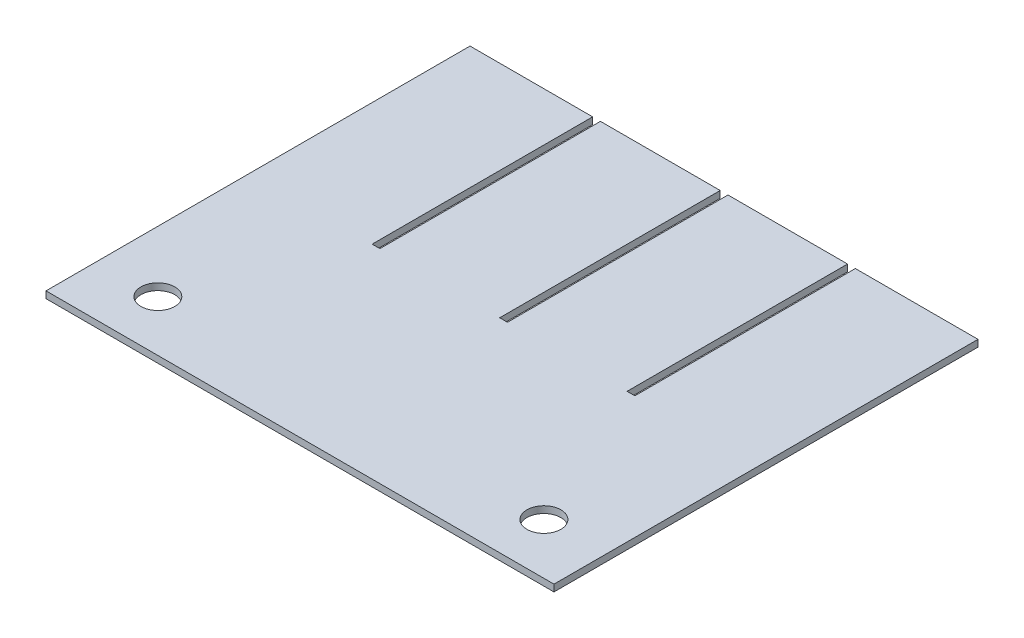
ISO-10303-21;
HEADER;
FILE_DESCRIPTION(('STEP AP214'),'2;1');
FILE_NAME('part.step','',(''),(''),'','','');
FILE_SCHEMA(('AUTOMOTIVE_DESIGN { 1 0 10303 214 1 1 1 1 }'));
ENDSEC;
DATA;
#1=APPLICATION_CONTEXT('core data for automotive mechanical design processes');
#2=APPLICATION_PROTOCOL_DEFINITION('international standard','automotive_design',2000,#1);
#3=PRODUCT_CONTEXT('',#1,'mechanical');
#4=PRODUCT('Part','Part','',(#3));
#5=PRODUCT_RELATED_PRODUCT_CATEGORY('part','',(#4));
#6=PRODUCT_DEFINITION_FORMATION('','',#4);
#7=PRODUCT_DEFINITION_CONTEXT('part definition',#1,'design');
#8=PRODUCT_DEFINITION('design','',#6,#7);
#9=PRODUCT_DEFINITION_SHAPE('','',#8);
#10=(LENGTH_UNIT() NAMED_UNIT(*) SI_UNIT(.MILLI.,.METRE.));
#11=(NAMED_UNIT(*) PLANE_ANGLE_UNIT() SI_UNIT($,.RADIAN.));
#12=(NAMED_UNIT(*) SI_UNIT($,.STERADIAN.) SOLID_ANGLE_UNIT());
#13=UNCERTAINTY_MEASURE_WITH_UNIT(LENGTH_MEASURE(1.E-05),#10,'distance_accuracy_value','');
#14=(GEOMETRIC_REPRESENTATION_CONTEXT(3) GLOBAL_UNCERTAINTY_ASSIGNED_CONTEXT((#13)) GLOBAL_UNIT_ASSIGNED_CONTEXT((#10,
#11,#12)) REPRESENTATION_CONTEXT('',''));
#15=CARTESIAN_POINT('',(0.,0.,0.));
#16=DIRECTION('',(0.,0.,1.));
#17=DIRECTION('',(1.,0.,0.));
#18=AXIS2_PLACEMENT_3D('',#15,#16,#17);
#19=CARTESIAN_POINT('',(0.,2.,0.));
#20=DIRECTION('',(0.,1.,0.));
#21=DIRECTION('',(0.,0.,1.));
#22=AXIS2_PLACEMENT_3D('',#19,#20,#21);
#23=PLANE('',#22);
#24=CARTESIAN_POINT('',(-56.905,2.,47.5));
#25=DIRECTION('',(0.,1.,0.));
#26=DIRECTION('',(0.,0.,1.));
#27=AXIS2_PLACEMENT_3D('',#24,#25,#26);
#28=CIRCLE('',#27,5.);
#29=CARTESIAN_POINT('',(-56.905,2.,52.5));
#30=VERTEX_POINT('',#29);
#31=EDGE_CURVE('E186',#30,#30,#28,.T.);
#32=ORIENTED_EDGE('',*,*,#31,.F.);
#33=EDGE_LOOP('',(#32));
#34=FACE_BOUND('',#33,.T.);
#35=DIRECTION('',(0.,0.,-1.));
#36=VECTOR('',#35,1.);
#37=CARTESIAN_POINT('',(74.875,2.,-62.5));
#38=LINE('',#37,#36);
#39=CARTESIAN_POINT('',(74.875,2.,62.5));
#40=VERTEX_POINT('',#39);
#41=CARTESIAN_POINT('',(74.875,2.,-62.5));
#42=VERTEX_POINT('',#41);
#43=EDGE_CURVE('E213',#40,#42,#38,.T.);
#44=ORIENTED_EDGE('',*,*,#43,.T.);
#45=DIRECTION('',(-1.,0.,0.));
#46=VECTOR('',#45,1.);
#47=CARTESIAN_POINT('',(38.725,2.,-62.5));
#48=LINE('',#47,#46);
#49=CARTESIAN_POINT('',(38.725,2.,-62.5));
#50=VERTEX_POINT('',#49);
#51=EDGE_CURVE('E121',#42,#50,#48,.T.);
#52=ORIENTED_EDGE('',*,*,#51,.T.);
#53=DIRECTION('',(0.,0.,1.));
#54=VECTOR('',#53,1.);
#55=CARTESIAN_POINT('',(38.725,2.,-62.5));
#56=LINE('',#55,#54);
#57=CARTESIAN_POINT('',(38.725,2.,2.5));
#58=VERTEX_POINT('',#57);
#59=EDGE_CURVE('E252',#50,#58,#56,.T.);
#60=ORIENTED_EDGE('',*,*,#59,.T.);
#61=DIRECTION('',(-1.,0.,0.));
#62=VECTOR('',#61,1.);
#63=CARTESIAN_POINT('',(38.725,2.,2.5));
#64=LINE('',#63,#62);
#65=CARTESIAN_POINT('',(36.425,2.,2.5));
#66=VERTEX_POINT('',#65);
#67=EDGE_CURVE('E271',#58,#66,#64,.T.);
#68=ORIENTED_EDGE('',*,*,#67,.T.);
#69=DIRECTION('',(0.,0.,-1.));
#70=VECTOR('',#69,1.);
#71=CARTESIAN_POINT('',(36.425,2.,-62.5));
#72=LINE('',#71,#70);
#73=CARTESIAN_POINT('',(36.425,2.,-62.5));
#74=VERTEX_POINT('',#73);
#75=EDGE_CURVE('E268',#66,#74,#72,.T.);
#76=ORIENTED_EDGE('',*,*,#75,.T.);
#77=DIRECTION('',(-1.,0.,0.));
#78=VECTOR('',#77,1.);
#79=CARTESIAN_POINT('',(1.17500000000002,2.,-62.5));
#80=LINE('',#79,#78);
#81=CARTESIAN_POINT('',(1.17500000000002,2.,-62.5));
#82=VERTEX_POINT('',#81);
#83=EDGE_CURVE('E270',#74,#82,#80,.T.);
#84=ORIENTED_EDGE('',*,*,#83,.T.);
#85=DIRECTION('',(0.,0.,1.));
#86=VECTOR('',#85,1.);
#87=CARTESIAN_POINT('',(1.17500000000002,2.,-62.5));
#88=LINE('',#87,#86);
#89=CARTESIAN_POINT('',(1.17500000000003,2.,2.5));
#90=VERTEX_POINT('',#89);
#91=EDGE_CURVE('E273',#82,#90,#88,.T.);
#92=ORIENTED_EDGE('',*,*,#91,.T.);
#93=DIRECTION('',(-1.,0.,0.));
#94=VECTOR('',#93,1.);
#95=CARTESIAN_POINT('',(-1.12499999999997,2.,2.5));
#96=LINE('',#95,#94);
#97=CARTESIAN_POINT('',(-1.12499999999997,2.,2.5));
#98=VERTEX_POINT('',#97);
#99=EDGE_CURVE('E279',#90,#98,#96,.T.);
#100=ORIENTED_EDGE('',*,*,#99,.T.);
#101=DIRECTION('',(0.,0.,-1.));
#102=VECTOR('',#101,1.);
#103=CARTESIAN_POINT('',(-1.12499999999998,2.,-62.5));
#104=LINE('',#103,#102);
#105=CARTESIAN_POINT('',(-1.12499999999998,2.,-62.5));
#106=VERTEX_POINT('',#105);
#107=EDGE_CURVE('E281',#98,#106,#104,.T.);
#108=ORIENTED_EDGE('',*,*,#107,.T.);
#109=DIRECTION('',(-1.,0.,0.));
#110=VECTOR('',#109,1.);
#111=CARTESIAN_POINT('',(-36.425,2.,-62.5));
#112=LINE('',#111,#110);
#113=CARTESIAN_POINT('',(-36.425,2.,-62.5));
#114=VERTEX_POINT('',#113);
#115=EDGE_CURVE('E283',#106,#114,#112,.T.);
#116=ORIENTED_EDGE('',*,*,#115,.T.);
#117=DIRECTION('',(0.,0.,1.));
#118=VECTOR('',#117,1.);
#119=CARTESIAN_POINT('',(-36.425,2.,-62.5));
#120=LINE('',#119,#118);
#121=CARTESIAN_POINT('',(-36.425,2.,2.5));
#122=VERTEX_POINT('',#121);
#123=EDGE_CURVE('E285',#114,#122,#120,.T.);
#124=ORIENTED_EDGE('',*,*,#123,.T.);
#125=DIRECTION('',(-1.,0.,0.));
#126=VECTOR('',#125,1.);
#127=CARTESIAN_POINT('',(-38.725,2.,2.5));
#128=LINE('',#127,#126);
#129=CARTESIAN_POINT('',(-38.725,2.,2.5));
#130=VERTEX_POINT('',#129);
#131=EDGE_CURVE('E287',#122,#130,#128,.T.);
#132=ORIENTED_EDGE('',*,*,#131,.T.);
#133=DIRECTION('',(0.,0.,-1.));
#134=VECTOR('',#133,1.);
#135=CARTESIAN_POINT('',(-38.725,2.,-62.5));
#136=LINE('',#135,#134);
#137=CARTESIAN_POINT('',(-38.725,2.,-62.5));
#138=VERTEX_POINT('',#137);
#139=EDGE_CURVE('E164',#130,#138,#136,.T.);
#140=ORIENTED_EDGE('',*,*,#139,.T.);
#141=DIRECTION('',(-1.,0.,0.));
#142=VECTOR('',#141,1.);
#143=CARTESIAN_POINT('',(-74.875,2.,-62.5));
#144=LINE('',#143,#142);
#145=CARTESIAN_POINT('',(-74.875,2.,-62.5));
#146=VERTEX_POINT('',#145);
#147=EDGE_CURVE('E158',#138,#146,#144,.T.);
#148=ORIENTED_EDGE('',*,*,#147,.T.);
#149=DIRECTION('',(0.,0.,1.));
#150=VECTOR('',#149,1.);
#151=CARTESIAN_POINT('',(-74.875,2.,-62.5));
#152=LINE('',#151,#150);
#153=CARTESIAN_POINT('',(-74.875,2.,62.5));
#154=VERTEX_POINT('',#153);
#155=EDGE_CURVE('E162',#146,#154,#152,.T.);
#156=ORIENTED_EDGE('',*,*,#155,.T.);
#157=DIRECTION('',(1.,0.,0.));
#158=VECTOR('',#157,1.);
#159=CARTESIAN_POINT('',(-74.875,2.,62.5));
#160=LINE('',#159,#158);
#161=EDGE_CURVE('E54',#154,#40,#160,.T.);
#162=ORIENTED_EDGE('',*,*,#161,.T.);
#163=EDGE_LOOP('',(#44,#52,#60,#68,#76,#84,#92,#100,#108,#116,#124,#132,#140,#148,#156,#162));
#164=FACE_BOUND('',#163,.T.);
#165=CARTESIAN_POINT('',(56.905,2.,47.5));
#166=DIRECTION('',(0.,1.,0.));
#167=DIRECTION('',(0.,0.,1.));
#168=AXIS2_PLACEMENT_3D('',#165,#166,#167);
#169=CIRCLE('',#168,5.);
#170=CARTESIAN_POINT('',(56.905,2.,52.5));
#171=VERTEX_POINT('',#170);
#172=EDGE_CURVE('E329',#171,#171,#169,.T.);
#173=ORIENTED_EDGE('',*,*,#172,.F.);
#174=EDGE_LOOP('',(#173));
#175=FACE_BOUND('',#174,.T.);
#176=ADVANCED_FACE('F37',(#34,#164,#175),#23,.T.);
#177=CARTESIAN_POINT('',(0.,0.,0.));
#178=DIRECTION('',(0.,1.,0.));
#179=DIRECTION('',(0.,0.,1.));
#180=AXIS2_PLACEMENT_3D('',#177,#178,#179);
#181=PLANE('',#180);
#182=DIRECTION('',(0.,0.,-1.));
#183=VECTOR('',#182,1.);
#184=CARTESIAN_POINT('',(74.875,0.,-62.5));
#185=LINE('',#184,#183);
#186=CARTESIAN_POINT('',(74.875,0.,62.5));
#187=VERTEX_POINT('',#186);
#188=CARTESIAN_POINT('',(74.875,0.,-62.5));
#189=VERTEX_POINT('',#188);
#190=EDGE_CURVE('E182',#187,#189,#185,.T.);
#191=ORIENTED_EDGE('',*,*,#190,.F.);
#192=DIRECTION('',(1.,0.,0.));
#193=VECTOR('',#192,1.);
#194=CARTESIAN_POINT('',(-74.875,0.,62.5));
#195=LINE('',#194,#193);
#196=CARTESIAN_POINT('',(-74.875,0.,62.5));
#197=VERTEX_POINT('',#196);
#198=EDGE_CURVE('E113',#197,#187,#195,.T.);
#199=ORIENTED_EDGE('',*,*,#198,.F.);
#200=DIRECTION('',(0.,0.,1.));
#201=VECTOR('',#200,1.);
#202=CARTESIAN_POINT('',(-74.875,0.,-62.5));
#203=LINE('',#202,#201);
#204=CARTESIAN_POINT('',(-74.875,0.,-62.5));
#205=VERTEX_POINT('',#204);
#206=EDGE_CURVE('E107',#205,#197,#203,.T.);
#207=ORIENTED_EDGE('',*,*,#206,.F.);
#208=DIRECTION('',(-1.,0.,0.));
#209=VECTOR('',#208,1.);
#210=CARTESIAN_POINT('',(-74.875,0.,-62.5));
#211=LINE('',#210,#209);
#212=CARTESIAN_POINT('',(-38.725,0.,-62.5));
#213=VERTEX_POINT('',#212);
#214=EDGE_CURVE('E172',#213,#205,#211,.T.);
#215=ORIENTED_EDGE('',*,*,#214,.F.);
#216=DIRECTION('',(0.,0.,-1.));
#217=VECTOR('',#216,1.);
#218=CARTESIAN_POINT('',(-38.725,0.,-62.5));
#219=LINE('',#218,#217);
#220=CARTESIAN_POINT('',(-38.725,0.,2.5));
#221=VERTEX_POINT('',#220);
#222=EDGE_CURVE('E208',#221,#213,#219,.T.);
#223=ORIENTED_EDGE('',*,*,#222,.F.);
#224=DIRECTION('',(-1.,0.,0.));
#225=VECTOR('',#224,1.);
#226=CARTESIAN_POINT('',(-38.725,0.,2.5));
#227=LINE('',#226,#225);
#228=CARTESIAN_POINT('',(-36.425,0.,2.5));
#229=VERTEX_POINT('',#228);
#230=EDGE_CURVE('E206',#229,#221,#227,.T.);
#231=ORIENTED_EDGE('',*,*,#230,.F.);
#232=DIRECTION('',(0.,0.,1.));
#233=VECTOR('',#232,1.);
#234=CARTESIAN_POINT('',(-36.425,0.,-62.5));
#235=LINE('',#234,#233);
#236=CARTESIAN_POINT('',(-36.425,0.,-62.5));
#237=VERTEX_POINT('',#236);
#238=EDGE_CURVE('E204',#237,#229,#235,.T.);
#239=ORIENTED_EDGE('',*,*,#238,.F.);
#240=DIRECTION('',(-1.,0.,0.));
#241=VECTOR('',#240,1.);
#242=CARTESIAN_POINT('',(-36.425,0.,-62.5));
#243=LINE('',#242,#241);
#244=CARTESIAN_POINT('',(-1.12499999999998,0.,-62.5));
#245=VERTEX_POINT('',#244);
#246=EDGE_CURVE('E202',#245,#237,#243,.T.);
#247=ORIENTED_EDGE('',*,*,#246,.F.);
#248=DIRECTION('',(0.,0.,-1.));
#249=VECTOR('',#248,1.);
#250=CARTESIAN_POINT('',(-1.12499999999998,0.,-62.5));
#251=LINE('',#250,#249);
#252=CARTESIAN_POINT('',(-1.12499999999997,0.,2.5));
#253=VERTEX_POINT('',#252);
#254=EDGE_CURVE('E200',#253,#245,#251,.T.);
#255=ORIENTED_EDGE('',*,*,#254,.F.);
#256=DIRECTION('',(-1.,0.,0.));
#257=VECTOR('',#256,1.);
#258=CARTESIAN_POINT('',(-1.12499999999997,0.,2.5));
#259=LINE('',#258,#257);
#260=CARTESIAN_POINT('',(1.17500000000003,0.,2.5));
#261=VERTEX_POINT('',#260);
#262=EDGE_CURVE('E198',#261,#253,#259,.T.);
#263=ORIENTED_EDGE('',*,*,#262,.F.);
#264=DIRECTION('',(0.,0.,1.));
#265=VECTOR('',#264,1.);
#266=CARTESIAN_POINT('',(1.17500000000002,0.,-62.5));
#267=LINE('',#266,#265);
#268=CARTESIAN_POINT('',(1.17500000000002,0.,-62.5));
#269=VERTEX_POINT('',#268);
#270=EDGE_CURVE('E196',#269,#261,#267,.T.);
#271=ORIENTED_EDGE('',*,*,#270,.F.);
#272=DIRECTION('',(-1.,0.,0.));
#273=VECTOR('',#272,1.);
#274=CARTESIAN_POINT('',(1.17500000000002,0.,-62.5));
#275=LINE('',#274,#273);
#276=CARTESIAN_POINT('',(36.425,0.,-62.5));
#277=VERTEX_POINT('',#276);
#278=EDGE_CURVE('E194',#277,#269,#275,.T.);
#279=ORIENTED_EDGE('',*,*,#278,.F.);
#280=DIRECTION('',(0.,0.,-1.));
#281=VECTOR('',#280,1.);
#282=CARTESIAN_POINT('',(36.425,0.,-62.5));
#283=LINE('',#282,#281);
#284=CARTESIAN_POINT('',(36.425,0.,2.5));
#285=VERTEX_POINT('',#284);
#286=EDGE_CURVE('E192',#285,#277,#283,.T.);
#287=ORIENTED_EDGE('',*,*,#286,.F.);
#288=DIRECTION('',(-1.,0.,0.));
#289=VECTOR('',#288,1.);
#290=CARTESIAN_POINT('',(38.725,0.,2.5));
#291=LINE('',#290,#289);
#292=CARTESIAN_POINT('',(38.725,0.,2.5));
#293=VERTEX_POINT('',#292);
#294=EDGE_CURVE('E190',#293,#285,#291,.T.);
#295=ORIENTED_EDGE('',*,*,#294,.F.);
#296=DIRECTION('',(0.,0.,1.));
#297=VECTOR('',#296,1.);
#298=CARTESIAN_POINT('',(38.725,0.,-62.5));
#299=LINE('',#298,#297);
#300=CARTESIAN_POINT('',(38.725,0.,-62.5));
#301=VERTEX_POINT('',#300);
#302=EDGE_CURVE('E188',#301,#293,#299,.T.);
#303=ORIENTED_EDGE('',*,*,#302,.F.);
#304=DIRECTION('',(-1.,0.,0.));
#305=VECTOR('',#304,1.);
#306=CARTESIAN_POINT('',(38.725,0.,-62.5));
#307=LINE('',#306,#305);
#308=EDGE_CURVE('E185',#189,#301,#307,.T.);
#309=ORIENTED_EDGE('',*,*,#308,.F.);
#310=EDGE_LOOP('',(#191,#199,#207,#215,#223,#231,#239,#247,#255,#263,#271,#279,#287,#295,#303,#309));
#311=FACE_BOUND('',#310,.T.);
#312=CARTESIAN_POINT('',(-56.905,0.,47.5));
#313=DIRECTION('',(0.,1.,0.));
#314=DIRECTION('',(0.,0.,1.));
#315=AXIS2_PLACEMENT_3D('',#312,#313,#314);
#316=CIRCLE('',#315,5.);
#317=CARTESIAN_POINT('',(-56.905,0.,52.5));
#318=VERTEX_POINT('',#317);
#319=EDGE_CURVE('E335',#318,#318,#316,.T.);
#320=ORIENTED_EDGE('',*,*,#319,.T.);
#321=EDGE_LOOP('',(#320));
#322=FACE_BOUND('',#321,.T.);
#323=CARTESIAN_POINT('',(56.905,0.,47.5));
#324=DIRECTION('',(0.,1.,0.));
#325=DIRECTION('',(0.,0.,1.));
#326=AXIS2_PLACEMENT_3D('',#323,#324,#325);
#327=CIRCLE('',#326,5.);
#328=CARTESIAN_POINT('',(56.905,0.,52.5));
#329=VERTEX_POINT('',#328);
#330=EDGE_CURVE('E332',#329,#329,#327,.T.);
#331=ORIENTED_EDGE('',*,*,#330,.T.);
#332=EDGE_LOOP('',(#331));
#333=FACE_BOUND('',#332,.T.);
#334=ADVANCED_FACE('F256',(#311,#322,#333),#181,.F.);
#335=CARTESIAN_POINT('',(74.875,2.,-62.5));
#336=DIRECTION('',(-1.,0.,0.));
#337=DIRECTION('',(0.,0.,1.));
#338=AXIS2_PLACEMENT_3D('',#335,#336,#337);
#339=PLANE('',#338);
#340=ORIENTED_EDGE('',*,*,#190,.T.);
#341=DIRECTION('',(0.,-1.,0.));
#342=VECTOR('',#341,1.);
#343=CARTESIAN_POINT('',(74.875,2.,-62.5));
#344=LINE('',#343,#342);
#345=EDGE_CURVE('E11',#42,#189,#344,.T.);
#346=ORIENTED_EDGE('',*,*,#345,.F.);
#347=ORIENTED_EDGE('',*,*,#43,.F.);
#348=DIRECTION('',(0.,-1.,0.));
#349=VECTOR('',#348,1.);
#350=CARTESIAN_POINT('',(74.875,2.,62.5));
#351=LINE('',#350,#349);
#352=EDGE_CURVE('E178',#40,#187,#351,.T.);
#353=ORIENTED_EDGE('',*,*,#352,.T.);
#354=EDGE_LOOP('',(#340,#346,#347,#353));
#355=FACE_BOUND('',#354,.T.);
#356=ADVANCED_FACE('F39',(#355),#339,.F.);
#357=CARTESIAN_POINT('',(38.725,2.,-62.5));
#358=DIRECTION('',(0.,0.,1.));
#359=DIRECTION('',(1.,0.,0.));
#360=AXIS2_PLACEMENT_3D('',#357,#358,#359);
#361=PLANE('',#360);
#362=ORIENTED_EDGE('',*,*,#308,.T.);
#363=DIRECTION('',(0.,-1.,0.));
#364=VECTOR('',#363,1.);
#365=CARTESIAN_POINT('',(38.725,2.,-62.5));
#366=LINE('',#365,#364);
#367=EDGE_CURVE('E46',#50,#301,#366,.T.);
#368=ORIENTED_EDGE('',*,*,#367,.F.);
#369=ORIENTED_EDGE('',*,*,#51,.F.);
#370=ORIENTED_EDGE('',*,*,#345,.T.);
#371=EDGE_LOOP('',(#362,#368,#369,#370));
#372=FACE_BOUND('',#371,.T.);
#373=ADVANCED_FACE('F482',(#372),#361,.F.);
#374=CARTESIAN_POINT('',(38.725,2.,-62.5));
#375=DIRECTION('',(1.,0.,0.));
#376=DIRECTION('',(0.,0.,-1.));
#377=AXIS2_PLACEMENT_3D('',#374,#375,#376);
#378=PLANE('',#377);
#379=ORIENTED_EDGE('',*,*,#302,.T.);
#380=DIRECTION('',(0.,-1.,0.));
#381=VECTOR('',#380,1.);
#382=CARTESIAN_POINT('',(38.725,2.,2.5));
#383=LINE('',#382,#381);
#384=EDGE_CURVE('E244',#58,#293,#383,.T.);
#385=ORIENTED_EDGE('',*,*,#384,.F.);
#386=ORIENTED_EDGE('',*,*,#59,.F.);
#387=ORIENTED_EDGE('',*,*,#367,.T.);
#388=EDGE_LOOP('',(#379,#385,#386,#387));
#389=FACE_BOUND('',#388,.T.);
#390=ADVANCED_FACE('F250',(#389),#378,.F.);
#391=CARTESIAN_POINT('',(38.725,2.,2.5));
#392=DIRECTION('',(0.,0.,1.));
#393=DIRECTION('',(1.,0.,0.));
#394=AXIS2_PLACEMENT_3D('',#391,#392,#393);
#395=PLANE('',#394);
#396=ORIENTED_EDGE('',*,*,#294,.T.);
#397=DIRECTION('',(0.,-1.,0.));
#398=VECTOR('',#397,1.);
#399=CARTESIAN_POINT('',(36.425,2.,2.5));
#400=LINE('',#399,#398);
#401=EDGE_CURVE('E241',#66,#285,#400,.T.);
#402=ORIENTED_EDGE('',*,*,#401,.F.);
#403=ORIENTED_EDGE('',*,*,#67,.F.);
#404=ORIENTED_EDGE('',*,*,#384,.T.);
#405=EDGE_LOOP('',(#396,#402,#403,#404));
#406=FACE_BOUND('',#405,.T.);
#407=ADVANCED_FACE('F262',(#406),#395,.F.);
#408=CARTESIAN_POINT('',(36.425,2.,-62.5));
#409=DIRECTION('',(-1.,0.,0.));
#410=DIRECTION('',(0.,0.,1.));
#411=AXIS2_PLACEMENT_3D('',#408,#409,#410);
#412=PLANE('',#411);
#413=ORIENTED_EDGE('',*,*,#286,.T.);
#414=DIRECTION('',(0.,-1.,0.));
#415=VECTOR('',#414,1.);
#416=CARTESIAN_POINT('',(36.425,2.,-62.5));
#417=LINE('',#416,#415);
#418=EDGE_CURVE('E238',#74,#277,#417,.T.);
#419=ORIENTED_EDGE('',*,*,#418,.F.);
#420=ORIENTED_EDGE('',*,*,#75,.F.);
#421=ORIENTED_EDGE('',*,*,#401,.T.);
#422=EDGE_LOOP('',(#413,#419,#420,#421));
#423=FACE_BOUND('',#422,.T.);
#424=ADVANCED_FACE('F266',(#423),#412,.F.);
#425=CARTESIAN_POINT('',(1.17500000000002,2.,-62.5));
#426=DIRECTION('',(0.,0.,1.));
#427=DIRECTION('',(1.,0.,0.));
#428=AXIS2_PLACEMENT_3D('',#425,#426,#427);
#429=PLANE('',#428);
#430=ORIENTED_EDGE('',*,*,#278,.T.);
#431=DIRECTION('',(0.,-1.,0.));
#432=VECTOR('',#431,1.);
#433=CARTESIAN_POINT('',(1.17500000000002,2.,-62.5));
#434=LINE('',#433,#432);
#435=EDGE_CURVE('E235',#82,#269,#434,.T.);
#436=ORIENTED_EDGE('',*,*,#435,.F.);
#437=ORIENTED_EDGE('',*,*,#83,.F.);
#438=ORIENTED_EDGE('',*,*,#418,.T.);
#439=EDGE_LOOP('',(#430,#436,#437,#438));
#440=FACE_BOUND('',#439,.T.);
#441=ADVANCED_FACE('F443',(#440),#429,.F.);
#442=CARTESIAN_POINT('',(1.17500000000002,2.,-62.5));
#443=DIRECTION('',(1.,0.,0.));
#444=DIRECTION('',(0.,0.,-1.));
#445=AXIS2_PLACEMENT_3D('',#442,#443,#444);
#446=PLANE('',#445);
#447=ORIENTED_EDGE('',*,*,#270,.T.);
#448=DIRECTION('',(0.,-1.,0.));
#449=VECTOR('',#448,1.);
#450=CARTESIAN_POINT('',(1.17500000000003,2.,2.5));
#451=LINE('',#450,#449);
#452=EDGE_CURVE('E232',#90,#261,#451,.T.);
#453=ORIENTED_EDGE('',*,*,#452,.F.);
#454=ORIENTED_EDGE('',*,*,#91,.F.);
#455=ORIENTED_EDGE('',*,*,#435,.T.);
#456=EDGE_LOOP('',(#447,#453,#454,#455));
#457=FACE_BOUND('',#456,.T.);
#458=ADVANCED_FACE('F432',(#457),#446,.F.);
#459=CARTESIAN_POINT('',(-1.12499999999997,2.,2.5));
#460=DIRECTION('',(0.,0.,1.));
#461=DIRECTION('',(1.,0.,0.));
#462=AXIS2_PLACEMENT_3D('',#459,#460,#461);
#463=PLANE('',#462);
#464=ORIENTED_EDGE('',*,*,#262,.T.);
#465=DIRECTION('',(0.,-1.,0.));
#466=VECTOR('',#465,1.);
#467=CARTESIAN_POINT('',(-1.12499999999997,2.,2.5));
#468=LINE('',#467,#466);
#469=EDGE_CURVE('E229',#98,#253,#468,.T.);
#470=ORIENTED_EDGE('',*,*,#469,.F.);
#471=ORIENTED_EDGE('',*,*,#99,.F.);
#472=ORIENTED_EDGE('',*,*,#452,.T.);
#473=EDGE_LOOP('',(#464,#470,#471,#472));
#474=FACE_BOUND('',#473,.T.);
#475=ADVANCED_FACE('F421',(#474),#463,.F.);
#476=CARTESIAN_POINT('',(-1.12499999999998,2.,-62.5));
#477=DIRECTION('',(-1.,0.,0.));
#478=DIRECTION('',(0.,0.,1.));
#479=AXIS2_PLACEMENT_3D('',#476,#477,#478);
#480=PLANE('',#479);
#481=ORIENTED_EDGE('',*,*,#254,.T.);
#482=DIRECTION('',(0.,-1.,0.));
#483=VECTOR('',#482,1.);
#484=CARTESIAN_POINT('',(-1.12499999999998,2.,-62.5));
#485=LINE('',#484,#483);
#486=EDGE_CURVE('E226',#106,#245,#485,.T.);
#487=ORIENTED_EDGE('',*,*,#486,.F.);
#488=ORIENTED_EDGE('',*,*,#107,.F.);
#489=ORIENTED_EDGE('',*,*,#469,.T.);
#490=EDGE_LOOP('',(#481,#487,#488,#489));
#491=FACE_BOUND('',#490,.T.);
#492=ADVANCED_FACE('F410',(#491),#480,.F.);
#493=CARTESIAN_POINT('',(-36.425,2.,-62.5));
#494=DIRECTION('',(0.,0.,1.));
#495=DIRECTION('',(1.,0.,0.));
#496=AXIS2_PLACEMENT_3D('',#493,#494,#495);
#497=PLANE('',#496);
#498=ORIENTED_EDGE('',*,*,#246,.T.);
#499=DIRECTION('',(0.,-1.,0.));
#500=VECTOR('',#499,1.);
#501=CARTESIAN_POINT('',(-36.425,2.,-62.5));
#502=LINE('',#501,#500);
#503=EDGE_CURVE('E223',#114,#237,#502,.T.);
#504=ORIENTED_EDGE('',*,*,#503,.F.);
#505=ORIENTED_EDGE('',*,*,#115,.F.);
#506=ORIENTED_EDGE('',*,*,#486,.T.);
#507=EDGE_LOOP('',(#498,#504,#505,#506));
#508=FACE_BOUND('',#507,.T.);
#509=ADVANCED_FACE('F399',(#508),#497,.F.);
#510=CARTESIAN_POINT('',(-36.425,2.,-62.5));
#511=DIRECTION('',(1.,0.,0.));
#512=DIRECTION('',(0.,0.,-1.));
#513=AXIS2_PLACEMENT_3D('',#510,#511,#512);
#514=PLANE('',#513);
#515=ORIENTED_EDGE('',*,*,#238,.T.);
#516=DIRECTION('',(0.,-1.,0.));
#517=VECTOR('',#516,1.);
#518=CARTESIAN_POINT('',(-36.425,2.,2.5));
#519=LINE('',#518,#517);
#520=EDGE_CURVE('E220',#122,#229,#519,.T.);
#521=ORIENTED_EDGE('',*,*,#520,.F.);
#522=ORIENTED_EDGE('',*,*,#123,.F.);
#523=ORIENTED_EDGE('',*,*,#503,.T.);
#524=EDGE_LOOP('',(#515,#521,#522,#523));
#525=FACE_BOUND('',#524,.T.);
#526=ADVANCED_FACE('F389',(#525),#514,.F.);
#527=CARTESIAN_POINT('',(-38.725,2.,2.5));
#528=DIRECTION('',(0.,0.,1.));
#529=DIRECTION('',(1.,0.,0.));
#530=AXIS2_PLACEMENT_3D('',#527,#528,#529);
#531=PLANE('',#530);
#532=ORIENTED_EDGE('',*,*,#230,.T.);
#533=DIRECTION('',(0.,-1.,0.));
#534=VECTOR('',#533,1.);
#535=CARTESIAN_POINT('',(-38.725,2.,2.5));
#536=LINE('',#535,#534);
#537=EDGE_CURVE('E217',#130,#221,#536,.T.);
#538=ORIENTED_EDGE('',*,*,#537,.F.);
#539=ORIENTED_EDGE('',*,*,#131,.F.);
#540=ORIENTED_EDGE('',*,*,#520,.T.);
#541=EDGE_LOOP('',(#532,#538,#539,#540));
#542=FACE_BOUND('',#541,.T.);
#543=ADVANCED_FACE('F293',(#542),#531,.F.);
#544=CARTESIAN_POINT('',(-38.725,2.,-62.5));
#545=DIRECTION('',(-1.,0.,0.));
#546=DIRECTION('',(0.,0.,1.));
#547=AXIS2_PLACEMENT_3D('',#544,#545,#546);
#548=PLANE('',#547);
#549=ORIENTED_EDGE('',*,*,#222,.T.);
#550=DIRECTION('',(0.,-1.,0.));
#551=VECTOR('',#550,1.);
#552=CARTESIAN_POINT('',(-38.725,2.,-62.5));
#553=LINE('',#552,#551);
#554=EDGE_CURVE('E173',#138,#213,#553,.T.);
#555=ORIENTED_EDGE('',*,*,#554,.F.);
#556=ORIENTED_EDGE('',*,*,#139,.F.);
#557=ORIENTED_EDGE('',*,*,#537,.T.);
#558=EDGE_LOOP('',(#549,#555,#556,#557));
#559=FACE_BOUND('',#558,.T.);
#560=ADVANCED_FACE('F297',(#559),#548,.F.);
#561=CARTESIAN_POINT('',(-74.875,2.,-62.5));
#562=DIRECTION('',(0.,0.,1.));
#563=DIRECTION('',(1.,0.,0.));
#564=AXIS2_PLACEMENT_3D('',#561,#562,#563);
#565=PLANE('',#564);
#566=ORIENTED_EDGE('',*,*,#214,.T.);
#567=DIRECTION('',(0.,-1.,0.));
#568=VECTOR('',#567,1.);
#569=CARTESIAN_POINT('',(-74.875,2.,-62.5));
#570=LINE('',#569,#568);
#571=EDGE_CURVE('E169',#146,#205,#570,.T.);
#572=ORIENTED_EDGE('',*,*,#571,.F.);
#573=ORIENTED_EDGE('',*,*,#147,.F.);
#574=ORIENTED_EDGE('',*,*,#554,.T.);
#575=EDGE_LOOP('',(#566,#572,#573,#574));
#576=FACE_BOUND('',#575,.T.);
#577=ADVANCED_FACE('F170',(#576),#565,.F.);
#578=CARTESIAN_POINT('',(-74.875,2.,-62.5));
#579=DIRECTION('',(1.,0.,0.));
#580=DIRECTION('',(0.,0.,-1.));
#581=AXIS2_PLACEMENT_3D('',#578,#579,#580);
#582=PLANE('',#581);
#583=ORIENTED_EDGE('',*,*,#206,.T.);
#584=DIRECTION('',(0.,-1.,0.));
#585=VECTOR('',#584,1.);
#586=CARTESIAN_POINT('',(-74.875,2.,62.5));
#587=LINE('',#586,#585);
#588=EDGE_CURVE('E174',#154,#197,#587,.T.);
#589=ORIENTED_EDGE('',*,*,#588,.F.);
#590=ORIENTED_EDGE('',*,*,#155,.F.);
#591=ORIENTED_EDGE('',*,*,#571,.T.);
#592=EDGE_LOOP('',(#583,#589,#590,#591));
#593=FACE_BOUND('',#592,.T.);
#594=ADVANCED_FACE('F176',(#593),#582,.F.);
#595=CARTESIAN_POINT('',(-74.875,2.,62.5));
#596=DIRECTION('',(0.,0.,-1.));
#597=DIRECTION('',(-1.,0.,0.));
#598=AXIS2_PLACEMENT_3D('',#595,#596,#597);
#599=PLANE('',#598);
#600=ORIENTED_EDGE('',*,*,#198,.T.);
#601=ORIENTED_EDGE('',*,*,#352,.F.);
#602=ORIENTED_EDGE('',*,*,#161,.F.);
#603=ORIENTED_EDGE('',*,*,#588,.T.);
#604=EDGE_LOOP('',(#600,#601,#602,#603));
#605=FACE_BOUND('',#604,.T.);
#606=ADVANCED_FACE('F301',(#605),#599,.F.);
#607=CARTESIAN_POINT('',(-56.905,2.,47.5));
#608=DIRECTION('',(0.,-1.,0.));
#609=DIRECTION('',(0.,0.,-1.));
#610=AXIS2_PLACEMENT_3D('',#607,#608,#609);
#611=CYLINDRICAL_SURFACE('',#610,5.);
#612=ORIENTED_EDGE('',*,*,#31,.T.);
#613=EDGE_LOOP('',(#612));
#614=FACE_BOUND('',#613,.T.);
#615=ORIENTED_EDGE('',*,*,#319,.F.);
#616=EDGE_LOOP('',(#615));
#617=FACE_BOUND('',#616,.T.);
#618=ADVANCED_FACE('F303',(#614,#617),#611,.F.);
#619=CARTESIAN_POINT('',(56.905,2.,47.5));
#620=DIRECTION('',(0.,-1.,0.));
#621=DIRECTION('',(0.,0.,-1.));
#622=AXIS2_PLACEMENT_3D('',#619,#620,#621);
#623=CYLINDRICAL_SURFACE('',#622,5.);
#624=ORIENTED_EDGE('',*,*,#172,.T.);
#625=EDGE_LOOP('',(#624));
#626=FACE_BOUND('',#625,.T.);
#627=ORIENTED_EDGE('',*,*,#330,.F.);
#628=EDGE_LOOP('',(#627));
#629=FACE_BOUND('',#628,.T.);
#630=ADVANCED_FACE('F309',(#626,#629),#623,.F.);
#631=CLOSED_SHELL('',(#176,#334,#356,#373,#390,#407,#424,#441,#458,#475,#492,#509,#526,#543,
#560,#577,#594,#606,#618,#630));
#632=MANIFOLD_SOLID_BREP('B2',#631);
#633=ADVANCED_BREP_SHAPE_REPRESENTATION('',(#18,#632),#14);
#634=SHAPE_DEFINITION_REPRESENTATION(#9,#633);
ENDSEC;
END-ISO-10303-21;
